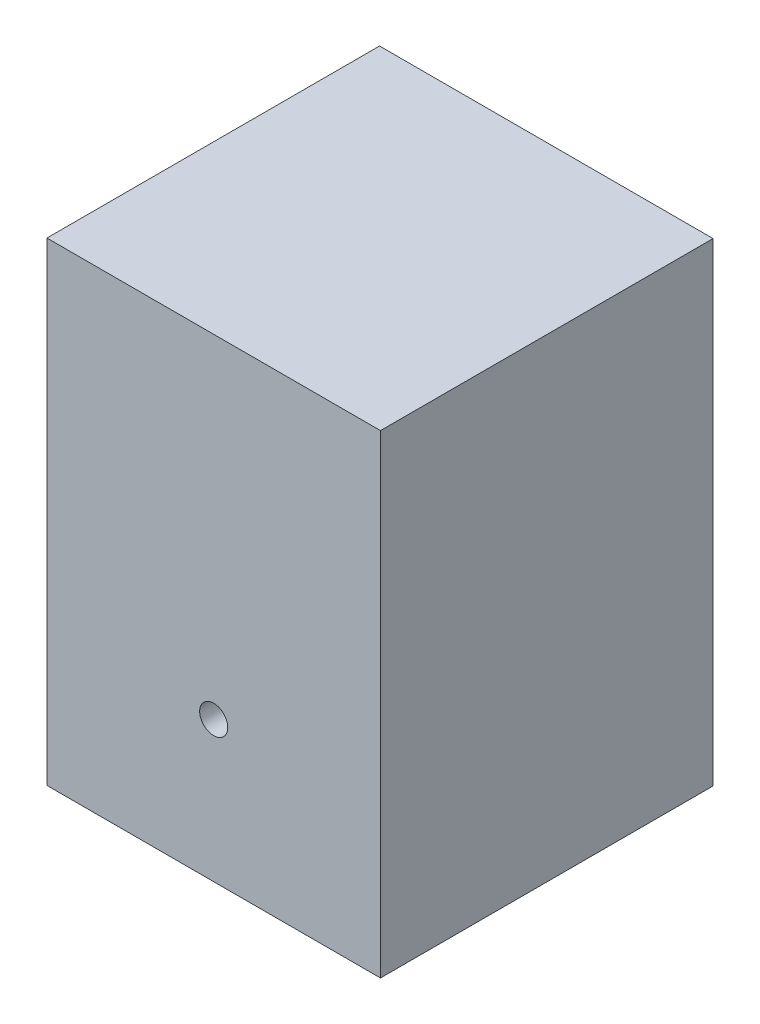
ISO-10303-21;
HEADER;
FILE_DESCRIPTION(('STEP AP214'),'2;1');
FILE_NAME('part.step','',(''),(''),'','','');
FILE_SCHEMA(('AUTOMOTIVE_DESIGN { 1 0 10303 214 1 1 1 1 }'));
ENDSEC;
DATA;
#1=APPLICATION_CONTEXT('core data for automotive mechanical design processes');
#2=APPLICATION_PROTOCOL_DEFINITION('international standard','automotive_design',2000,#1);
#3=PRODUCT_CONTEXT('',#1,'mechanical');
#4=PRODUCT('Part','Part','',(#3));
#5=PRODUCT_RELATED_PRODUCT_CATEGORY('part','',(#4));
#6=PRODUCT_DEFINITION_FORMATION('','',#4);
#7=PRODUCT_DEFINITION_CONTEXT('part definition',#1,'design');
#8=PRODUCT_DEFINITION('design','',#6,#7);
#9=PRODUCT_DEFINITION_SHAPE('','',#8);
#10=(LENGTH_UNIT() NAMED_UNIT(*) SI_UNIT(.MILLI.,.METRE.));
#11=(NAMED_UNIT(*) PLANE_ANGLE_UNIT() SI_UNIT($,.RADIAN.));
#12=(NAMED_UNIT(*) SI_UNIT($,.STERADIAN.) SOLID_ANGLE_UNIT());
#13=UNCERTAINTY_MEASURE_WITH_UNIT(LENGTH_MEASURE(1.E-05),#10,'distance_accuracy_value','');
#14=(GEOMETRIC_REPRESENTATION_CONTEXT(3) GLOBAL_UNCERTAINTY_ASSIGNED_CONTEXT((#13)) GLOBAL_UNIT_ASSIGNED_CONTEXT((#10,
#11,#12)) REPRESENTATION_CONTEXT('',''));
#15=CARTESIAN_POINT('',(0.,0.,0.));
#16=DIRECTION('',(0.,0.,1.));
#17=DIRECTION('',(1.,0.,0.));
#18=AXIS2_PLACEMENT_3D('',#15,#16,#17);
#19=CARTESIAN_POINT('',(0.,0.,35.5));
#20=DIRECTION('',(1.,0.,0.));
#21=DIRECTION('',(0.,0.,-1.));
#22=AXIS2_PLACEMENT_3D('',#19,#20,#21);
#23=PLANE('',#22);
#24=DIRECTION('',(0.,-1.,0.));
#25=VECTOR('',#24,1.);
#26=CARTESIAN_POINT('',(0.,0.,0.));
#27=LINE('',#26,#25);
#28=CARTESIAN_POINT('',(0.,50.6,0.));
#29=VERTEX_POINT('',#28);
#30=CARTESIAN_POINT('',(0.,0.,0.));
#31=VERTEX_POINT('',#30);
#32=EDGE_CURVE('E106',#29,#31,#27,.T.);
#33=ORIENTED_EDGE('',*,*,#32,.T.);
#34=DIRECTION('',(0.,0.,-1.));
#35=VECTOR('',#34,1.);
#36=CARTESIAN_POINT('',(0.,0.,35.5));
#37=LINE('',#36,#35);
#38=CARTESIAN_POINT('',(0.,0.,35.5));
#39=VERTEX_POINT('',#38);
#40=EDGE_CURVE('E11',#39,#31,#37,.T.);
#41=ORIENTED_EDGE('',*,*,#40,.F.);
#42=DIRECTION('',(0.,-1.,0.));
#43=VECTOR('',#42,1.);
#44=CARTESIAN_POINT('',(0.,0.,35.5));
#45=LINE('',#44,#43);
#46=CARTESIAN_POINT('',(0.,50.6,35.5));
#47=VERTEX_POINT('',#46);
#48=EDGE_CURVE('E90',#47,#39,#45,.T.);
#49=ORIENTED_EDGE('',*,*,#48,.F.);
#50=DIRECTION('',(0.,0.,-1.));
#51=VECTOR('',#50,1.);
#52=CARTESIAN_POINT('',(0.,50.6,35.5));
#53=LINE('',#52,#51);
#54=EDGE_CURVE('E102',#47,#29,#53,.T.);
#55=ORIENTED_EDGE('',*,*,#54,.T.);
#56=EDGE_LOOP('',(#33,#41,#49,#55));
#57=FACE_BOUND('',#56,.T.);
#58=ADVANCED_FACE('F38',(#57),#23,.F.);
#59=CARTESIAN_POINT('',(0.,0.,35.5));
#60=DIRECTION('',(0.,1.,0.));
#61=DIRECTION('',(0.,0.,1.));
#62=AXIS2_PLACEMENT_3D('',#59,#60,#61);
#63=PLANE('',#62);
#64=DIRECTION('',(1.,0.,0.));
#65=VECTOR('',#64,1.);
#66=CARTESIAN_POINT('',(0.,0.,0.));
#67=LINE('',#66,#65);
#68=CARTESIAN_POINT('',(35.6,0.,0.));
#69=VERTEX_POINT('',#68);
#70=EDGE_CURVE('E95',#31,#69,#67,.T.);
#71=ORIENTED_EDGE('',*,*,#70,.T.);
#72=DIRECTION('',(0.,0.,-1.));
#73=VECTOR('',#72,1.);
#74=CARTESIAN_POINT('',(35.6,0.,35.5));
#75=LINE('',#74,#73);
#76=CARTESIAN_POINT('',(35.6,0.,35.5));
#77=VERTEX_POINT('',#76);
#78=EDGE_CURVE('E47',#77,#69,#75,.T.);
#79=ORIENTED_EDGE('',*,*,#78,.F.);
#80=DIRECTION('',(1.,0.,0.));
#81=VECTOR('',#80,1.);
#82=CARTESIAN_POINT('',(0.,0.,35.5));
#83=LINE('',#82,#81);
#84=EDGE_CURVE('E85',#39,#77,#83,.T.);
#85=ORIENTED_EDGE('',*,*,#84,.F.);
#86=ORIENTED_EDGE('',*,*,#40,.T.);
#87=EDGE_LOOP('',(#71,#79,#85,#86));
#88=FACE_BOUND('',#87,.T.);
#89=ADVANCED_FACE('F94',(#88),#63,.F.);
#90=CARTESIAN_POINT('',(35.6,0.,35.5));
#91=DIRECTION('',(-1.,0.,0.));
#92=DIRECTION('',(0.,0.,1.));
#93=AXIS2_PLACEMENT_3D('',#90,#91,#92);
#94=PLANE('',#93);
#95=DIRECTION('',(0.,1.,0.));
#96=VECTOR('',#95,1.);
#97=CARTESIAN_POINT('',(35.6,0.,0.));
#98=LINE('',#97,#96);
#99=CARTESIAN_POINT('',(35.6,50.6,0.));
#100=VERTEX_POINT('',#99);
#101=EDGE_CURVE('E72',#69,#100,#98,.T.);
#102=ORIENTED_EDGE('',*,*,#101,.T.);
#103=DIRECTION('',(0.,0.,-1.));
#104=VECTOR('',#103,1.);
#105=CARTESIAN_POINT('',(35.6,50.6,35.5));
#106=LINE('',#105,#104);
#107=CARTESIAN_POINT('',(35.6,50.6,35.5));
#108=VERTEX_POINT('',#107);
#109=EDGE_CURVE('E97',#108,#100,#106,.T.);
#110=ORIENTED_EDGE('',*,*,#109,.F.);
#111=DIRECTION('',(0.,1.,0.));
#112=VECTOR('',#111,1.);
#113=CARTESIAN_POINT('',(35.6,0.,35.5));
#114=LINE('',#113,#112);
#115=EDGE_CURVE('E88',#77,#108,#114,.T.);
#116=ORIENTED_EDGE('',*,*,#115,.F.);
#117=ORIENTED_EDGE('',*,*,#78,.T.);
#118=EDGE_LOOP('',(#102,#110,#116,#117));
#119=FACE_BOUND('',#118,.T.);
#120=ADVANCED_FACE('F98',(#119),#94,.F.);
#121=CARTESIAN_POINT('',(0.,50.6,35.5));
#122=DIRECTION('',(0.,-1.,0.));
#123=DIRECTION('',(0.,0.,-1.));
#124=AXIS2_PLACEMENT_3D('',#121,#122,#123);
#125=PLANE('',#124);
#126=DIRECTION('',(-1.,0.,0.));
#127=VECTOR('',#126,1.);
#128=CARTESIAN_POINT('',(0.,50.6,0.));
#129=LINE('',#128,#127);
#130=EDGE_CURVE('E78',#100,#29,#129,.T.);
#131=ORIENTED_EDGE('',*,*,#130,.T.);
#132=ORIENTED_EDGE('',*,*,#54,.F.);
#133=DIRECTION('',(-1.,0.,0.));
#134=VECTOR('',#133,1.);
#135=CARTESIAN_POINT('',(0.,50.6,35.5));
#136=LINE('',#135,#134);
#137=EDGE_CURVE('E55',#108,#47,#136,.T.);
#138=ORIENTED_EDGE('',*,*,#137,.F.);
#139=ORIENTED_EDGE('',*,*,#109,.T.);
#140=EDGE_LOOP('',(#131,#132,#138,#139));
#141=FACE_BOUND('',#140,.T.);
#142=ADVANCED_FACE('F120',(#141),#125,.F.);
#143=CARTESIAN_POINT('',(0.,0.,35.5));
#144=DIRECTION('',(0.,0.,-1.));
#145=DIRECTION('',(-1.,0.,0.));
#146=AXIS2_PLACEMENT_3D('',#143,#144,#145);
#147=PLANE('',#146);
#148=CARTESIAN_POINT('',(17.8,15.,35.5));
#149=DIRECTION('',(0.,0.,1.));
#150=DIRECTION('',(1.,0.,0.));
#151=AXIS2_PLACEMENT_3D('',#148,#149,#150);
#152=CIRCLE('',#151,1.5);
#153=CARTESIAN_POINT('',(19.3,15.,35.5));
#154=VERTEX_POINT('',#153);
#155=EDGE_CURVE('E127',#154,#154,#152,.T.);
#156=ORIENTED_EDGE('',*,*,#155,.F.);
#157=EDGE_LOOP('',(#156));
#158=FACE_BOUND('',#157,.T.);
#159=ORIENTED_EDGE('',*,*,#48,.T.);
#160=ORIENTED_EDGE('',*,*,#84,.T.);
#161=ORIENTED_EDGE('',*,*,#115,.T.);
#162=ORIENTED_EDGE('',*,*,#137,.T.);
#163=EDGE_LOOP('',(#159,#160,#161,#162));
#164=FACE_BOUND('',#163,.T.);
#165=ADVANCED_FACE('F86',(#158,#164),#147,.F.);
#166=CARTESIAN_POINT('',(0.,0.,0.));
#167=DIRECTION('',(0.,0.,-1.));
#168=DIRECTION('',(-1.,0.,0.));
#169=AXIS2_PLACEMENT_3D('',#166,#167,#168);
#170=PLANE('',#169);
#171=ORIENTED_EDGE('',*,*,#32,.F.);
#172=ORIENTED_EDGE('',*,*,#130,.F.);
#173=ORIENTED_EDGE('',*,*,#101,.F.);
#174=ORIENTED_EDGE('',*,*,#70,.F.);
#175=EDGE_LOOP('',(#171,#172,#173,#174));
#176=FACE_BOUND('',#175,.T.);
#177=ADVANCED_FACE('F123',(#176),#170,.T.);
#178=CARTESIAN_POINT('',(17.8,15.,28.5));
#179=DIRECTION('',(0.,0.,1.));
#180=DIRECTION('',(1.,0.,0.));
#181=AXIS2_PLACEMENT_3D('',#178,#179,#180);
#182=CYLINDRICAL_SURFACE('',#181,1.5);
#183=CARTESIAN_POINT('',(17.8,15.,28.5));
#184=DIRECTION('',(0.,0.,1.));
#185=DIRECTION('',(1.,0.,0.));
#186=AXIS2_PLACEMENT_3D('',#183,#184,#185);
#187=CIRCLE('',#186,1.5);
#188=CARTESIAN_POINT('',(19.3,15.,28.5));
#189=VERTEX_POINT('',#188);
#190=EDGE_CURVE('E110',#189,#189,#187,.T.);
#191=ORIENTED_EDGE('',*,*,#190,.F.);
#192=EDGE_LOOP('',(#191));
#193=FACE_BOUND('',#192,.T.);
#194=ORIENTED_EDGE('',*,*,#155,.T.);
#195=EDGE_LOOP('',(#194));
#196=FACE_BOUND('',#195,.T.);
#197=ADVANCED_FACE('F137',(#193,#196),#182,.F.);
#198=CARTESIAN_POINT('',(17.8,15.,28.5));
#199=DIRECTION('',(0.,0.,1.));
#200=DIRECTION('',(1.,0.,0.));
#201=AXIS2_PLACEMENT_3D('',#198,#199,#200);
#202=PLANE('',#201);
#203=ORIENTED_EDGE('',*,*,#190,.T.);
#204=EDGE_LOOP('',(#203));
#205=FACE_BOUND('',#204,.T.);
#206=ADVANCED_FACE('F135',(#205),#202,.T.);
#207=CLOSED_SHELL('',(#58,#89,#120,#142,#165,#177,#197,#206));
#208=MANIFOLD_SOLID_BREP('B2',#207);
#209=ADVANCED_BREP_SHAPE_REPRESENTATION('',(#18,#208),#14);
#210=SHAPE_DEFINITION_REPRESENTATION(#9,#209);
ENDSEC;
END-ISO-10303-21;
